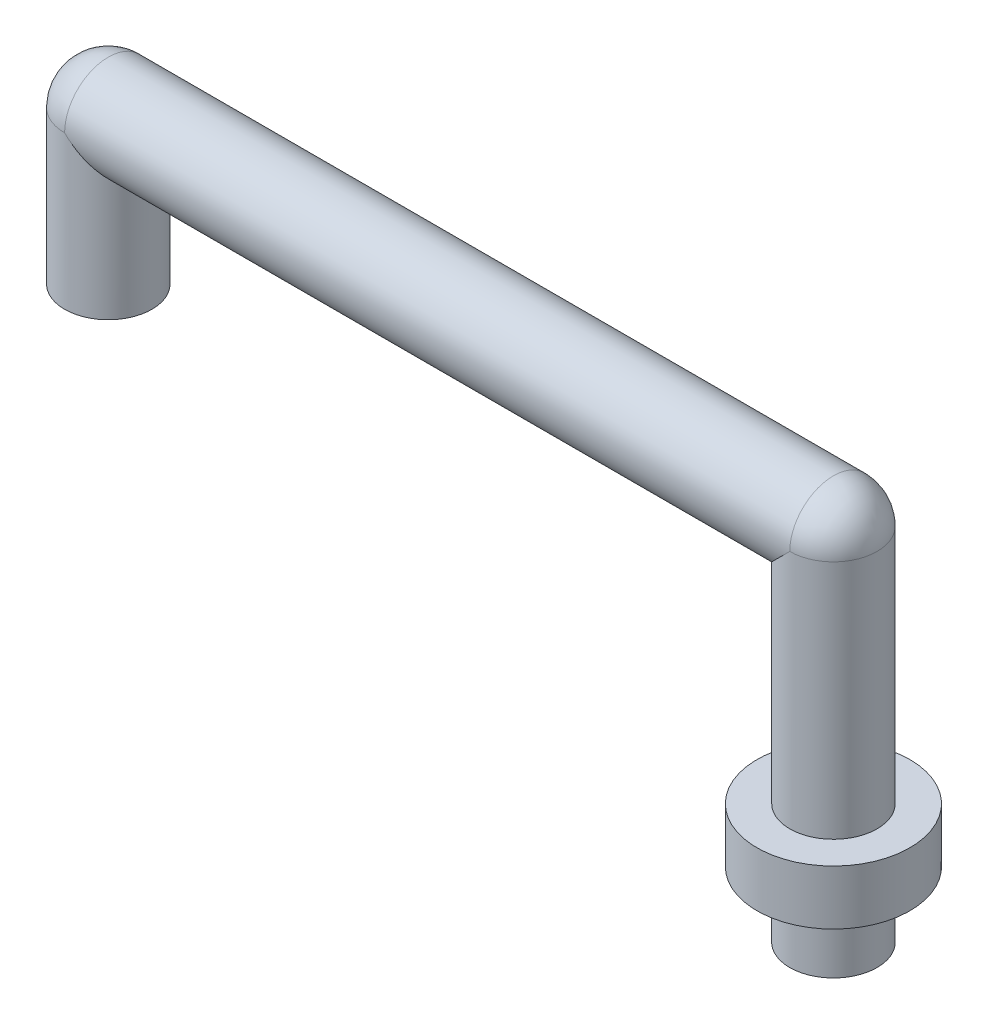
ISO-10303-21;
HEADER;
FILE_DESCRIPTION(('STEP AP214'),'2;1');
FILE_NAME('part.step','',(''),(''),'','','');
FILE_SCHEMA(('AUTOMOTIVE_DESIGN { 1 0 10303 214 1 1 1 1 }'));
ENDSEC;
DATA;
#1=APPLICATION_CONTEXT('core data for automotive mechanical design processes');
#2=APPLICATION_PROTOCOL_DEFINITION('international standard','automotive_design',2000,#1);
#3=PRODUCT_CONTEXT('',#1,'mechanical');
#4=PRODUCT('Part','Part','',(#3));
#5=PRODUCT_RELATED_PRODUCT_CATEGORY('part','',(#4));
#6=PRODUCT_DEFINITION_FORMATION('','',#4);
#7=PRODUCT_DEFINITION_CONTEXT('part definition',#1,'design');
#8=PRODUCT_DEFINITION('design','',#6,#7);
#9=PRODUCT_DEFINITION_SHAPE('','',#8);
#10=(LENGTH_UNIT() NAMED_UNIT(*) SI_UNIT(.MILLI.,.METRE.));
#11=(NAMED_UNIT(*) PLANE_ANGLE_UNIT() SI_UNIT($,.RADIAN.));
#12=(NAMED_UNIT(*) SI_UNIT($,.STERADIAN.) SOLID_ANGLE_UNIT());
#13=UNCERTAINTY_MEASURE_WITH_UNIT(LENGTH_MEASURE(1.E-05),#10,'distance_accuracy_value','');
#14=(GEOMETRIC_REPRESENTATION_CONTEXT(3) GLOBAL_UNCERTAINTY_ASSIGNED_CONTEXT((#13)) GLOBAL_UNIT_ASSIGNED_CONTEXT((#10,
#11,#12)) REPRESENTATION_CONTEXT('',''));
#15=CARTESIAN_POINT('',(0.,0.,0.));
#16=DIRECTION('',(0.,0.,1.));
#17=DIRECTION('',(1.,0.,0.));
#18=AXIS2_PLACEMENT_3D('',#15,#16,#17);
#19=CARTESIAN_POINT('',(0.,41.91,0.));
#20=DIRECTION('',(0.,-1.,0.));
#21=DIRECTION('',(0.,0.,-1.));
#22=AXIS2_PLACEMENT_3D('',#19,#20,#21);
#23=CYLINDRICAL_SURFACE('',#22,5.08);
#24=CARTESIAN_POINT('',(0.,13.97,0.));
#25=DIRECTION('',(0.,-1.,0.));
#26=DIRECTION('',(0.,0.,-1.));
#27=AXIS2_PLACEMENT_3D('',#24,#25,#26);
#28=CIRCLE('',#27,5.08);
#29=CARTESIAN_POINT('',(0.,13.97,-5.08));
#30=VERTEX_POINT('',#29);
#31=EDGE_CURVE('E11',#30,#30,#28,.T.);
#32=ORIENTED_EDGE('',*,*,#31,.F.);
#33=EDGE_LOOP('',(#32));
#34=FACE_BOUND('',#33,.T.);
#35=CARTESIAN_POINT('',(0.,41.91,0.));
#36=DIRECTION('',(0.707106781186547,-0.707106781186547,0.));
#37=DIRECTION('',(-0.707106781186547,-0.707106781186547,0.));
#38=AXIS2_PLACEMENT_3D('',#35,#36,#37);
#39=ELLIPSE('',#38,7.18420489685532,5.08);
#40=CARTESIAN_POINT('',(0.,41.91,-5.08));
#41=VERTEX_POINT('',#40);
#42=CARTESIAN_POINT('',(0.,41.91,5.08));
#43=VERTEX_POINT('',#42);
#44=EDGE_CURVE('E86',#41,#43,#39,.F.);
#45=ORIENTED_EDGE('',*,*,#44,.F.);
#46=CARTESIAN_POINT('',(0.,41.91,0.));
#47=DIRECTION('',(0.,1.,0.));
#48=DIRECTION('',(0.,0.,1.));
#49=AXIS2_PLACEMENT_3D('',#46,#47,#48);
#50=CIRCLE('',#49,5.08);
#51=EDGE_CURVE('E61',#43,#41,#50,.T.);
#52=ORIENTED_EDGE('',*,*,#51,.F.);
#53=EDGE_LOOP('',(#45,#52));
#54=FACE_BOUND('',#53,.T.);
#55=ADVANCED_FACE('F41',(#34,#54),#23,.T.);
#56=CARTESIAN_POINT('',(-8.89,13.97,0.));
#57=DIRECTION('',(0.,-1.,0.));
#58=DIRECTION('',(0.,0.,-1.));
#59=AXIS2_PLACEMENT_3D('',#56,#57,#58);
#60=PLANE('',#59);
#61=ORIENTED_EDGE('',*,*,#31,.T.);
#62=EDGE_LOOP('',(#61));
#63=FACE_BOUND('',#62,.T.);
#64=CARTESIAN_POINT('',(0.,13.97,0.));
#65=DIRECTION('',(0.,-1.,0.));
#66=DIRECTION('',(0.,0.,-1.));
#67=AXIS2_PLACEMENT_3D('',#64,#65,#66);
#68=CIRCLE('',#67,8.89);
#69=CARTESIAN_POINT('',(0.,13.97,-8.89));
#70=VERTEX_POINT('',#69);
#71=EDGE_CURVE('E91',#70,#70,#68,.T.);
#72=ORIENTED_EDGE('',*,*,#71,.F.);
#73=EDGE_LOOP('',(#72));
#74=FACE_BOUND('',#73,.T.);
#75=ADVANCED_FACE('F116',(#63,#74),#60,.F.);
#76=CARTESIAN_POINT('',(0.,0.,0.));
#77=DIRECTION('',(0.,-1.,0.));
#78=DIRECTION('',(0.,0.,-1.));
#79=AXIS2_PLACEMENT_3D('',#76,#77,#78);
#80=CYLINDRICAL_SURFACE('',#79,8.89);
#81=CARTESIAN_POINT('',(0.,7.62,0.));
#82=DIRECTION('',(0.,-1.,0.));
#83=DIRECTION('',(0.,0.,-1.));
#84=AXIS2_PLACEMENT_3D('',#81,#82,#83);
#85=CIRCLE('',#84,8.89);
#86=CARTESIAN_POINT('',(0.,7.62,-8.89));
#87=VERTEX_POINT('',#86);
#88=EDGE_CURVE('E88',#87,#87,#85,.T.);
#89=ORIENTED_EDGE('',*,*,#88,.F.);
#90=EDGE_LOOP('',(#89));
#91=FACE_BOUND('',#90,.T.);
#92=ORIENTED_EDGE('',*,*,#71,.T.);
#93=EDGE_LOOP('',(#92));
#94=FACE_BOUND('',#93,.T.);
#95=ADVANCED_FACE('F122',(#91,#94),#80,.T.);
#96=CARTESIAN_POINT('',(0.,7.62,0.));
#97=DIRECTION('',(0.,1.,0.));
#98=DIRECTION('',(0.,0.,1.));
#99=AXIS2_PLACEMENT_3D('',#96,#97,#98);
#100=PLANE('',#99);
#101=CARTESIAN_POINT('',(0.,7.61999999999999,0.));
#102=DIRECTION('',(0.,1.,0.));
#103=DIRECTION('',(0.,0.,1.));
#104=AXIS2_PLACEMENT_3D('',#101,#102,#103);
#105=CIRCLE('',#104,5.08);
#106=CARTESIAN_POINT('',(0.,7.61999999999999,5.08));
#107=VERTEX_POINT('',#106);
#108=EDGE_CURVE('E48',#107,#107,#105,.T.);
#109=ORIENTED_EDGE('',*,*,#108,.T.);
#110=EDGE_LOOP('',(#109));
#111=FACE_BOUND('',#110,.T.);
#112=ORIENTED_EDGE('',*,*,#88,.T.);
#113=EDGE_LOOP('',(#112));
#114=FACE_BOUND('',#113,.T.);
#115=ADVANCED_FACE('F100',(#111,#114),#100,.F.);
#116=CARTESIAN_POINT('',(0.,0.,0.));
#117=DIRECTION('',(0.,1.,0.));
#118=DIRECTION('',(0.,0.,1.));
#119=AXIS2_PLACEMENT_3D('',#116,#117,#118);
#120=PLANE('',#119);
#121=CARTESIAN_POINT('',(0.,0.,0.));
#122=DIRECTION('',(0.,1.,0.));
#123=DIRECTION('',(0.,0.,1.));
#124=AXIS2_PLACEMENT_3D('',#121,#122,#123);
#125=CIRCLE('',#124,5.08);
#126=CARTESIAN_POINT('',(0.,0.,5.08));
#127=VERTEX_POINT('',#126);
#128=EDGE_CURVE('E94',#127,#127,#125,.T.);
#129=ORIENTED_EDGE('',*,*,#128,.F.);
#130=EDGE_LOOP('',(#129));
#131=FACE_BOUND('',#130,.T.);
#132=ADVANCED_FACE('F105',(#131),#120,.F.);
#133=ORIENTED_EDGE('',*,*,#128,.T.);
#134=EDGE_LOOP('',(#133));
#135=FACE_BOUND('',#134,.T.);
#136=ORIENTED_EDGE('',*,*,#108,.F.);
#137=EDGE_LOOP('',(#136));
#138=FACE_BOUND('',#137,.T.);
#139=ADVANCED_FACE('F103',(#135,#138),#23,.T.);
#140=CARTESIAN_POINT('',(-84.328,41.91,0.));
#141=DIRECTION('',(-1.,0.,0.));
#142=DIRECTION('',(0.,0.,1.));
#143=AXIS2_PLACEMENT_3D('',#140,#141,#142);
#144=CYLINDRICAL_SURFACE('',#143,5.08);
#145=CARTESIAN_POINT('',(-84.328,41.91,0.));
#146=DIRECTION('',(-1.,0.,0.));
#147=DIRECTION('',(0.,0.,1.));
#148=AXIS2_PLACEMENT_3D('',#145,#146,#147);
#149=CIRCLE('',#148,5.07999999999999);
#150=CARTESIAN_POINT('',(-84.328,41.91,5.07999999999999));
#151=VERTEX_POINT('',#150);
#152=CARTESIAN_POINT('',(-84.328,41.91,-5.07999999999999));
#153=VERTEX_POINT('',#152);
#154=EDGE_CURVE('E54',#151,#153,#149,.T.);
#155=ORIENTED_EDGE('',*,*,#154,.F.);
#156=CARTESIAN_POINT('',(-84.328,41.91,0.));
#157=DIRECTION('',(-0.707106781186547,-0.707106781186547,0.));
#158=DIRECTION('',(-0.707106781186547,0.707106781186547,0.));
#159=AXIS2_PLACEMENT_3D('',#156,#157,#158);
#160=ELLIPSE('',#159,7.18420489685531,5.07999999999999);
#161=EDGE_CURVE('E66',#151,#153,#160,.F.);
#162=ORIENTED_EDGE('',*,*,#161,.T.);
#163=EDGE_LOOP('',(#155,#162));
#164=FACE_BOUND('',#163,.T.);
#165=CARTESIAN_POINT('',(0.,41.91,0.));
#166=DIRECTION('',(-1.,0.,0.));
#167=DIRECTION('',(0.,0.,1.));
#168=AXIS2_PLACEMENT_3D('',#165,#166,#167);
#169=CIRCLE('',#168,5.08);
#170=EDGE_CURVE('E76',#43,#41,#169,.T.);
#171=ORIENTED_EDGE('',*,*,#170,.T.);
#172=ORIENTED_EDGE('',*,*,#44,.T.);
#173=EDGE_LOOP('',(#171,#172));
#174=FACE_BOUND('',#173,.T.);
#175=ADVANCED_FACE('F67',(#164,#174),#144,.T.);
#176=CARTESIAN_POINT('',(0.,41.91,0.));
#177=DIRECTION('',(-1.,0.,0.));
#178=DIRECTION('',(0.,0.,-1.));
#179=AXIS2_PLACEMENT_3D('',#176,#177,#178);
#180=SPHERICAL_SURFACE('',#179,5.08);
#181=ORIENTED_EDGE('',*,*,#51,.T.);
#182=ORIENTED_EDGE('',*,*,#170,.F.);
#183=EDGE_LOOP('',(#181,#182));
#184=FACE_BOUND('',#183,.T.);
#185=ADVANCED_FACE('F112',(#184),#180,.T.);
#186=CARTESIAN_POINT('',(-84.328,41.91,0.));
#187=DIRECTION('',(0.,1.,0.));
#188=DIRECTION('',(0.,0.,1.));
#189=AXIS2_PLACEMENT_3D('',#186,#187,#188);
#190=SPHERICAL_SURFACE('',#189,5.07999999999999);
#191=ORIENTED_EDGE('',*,*,#154,.T.);
#192=CARTESIAN_POINT('',(-84.328,41.91,0.));
#193=DIRECTION('',(0.,1.,0.));
#194=DIRECTION('',(0.,0.,1.));
#195=AXIS2_PLACEMENT_3D('',#192,#193,#194);
#196=CIRCLE('',#195,5.07999999999999);
#197=EDGE_CURVE('E72',#153,#151,#196,.T.);
#198=ORIENTED_EDGE('',*,*,#197,.T.);
#199=EDGE_LOOP('',(#191,#198));
#200=FACE_BOUND('',#199,.T.);
#201=ADVANCED_FACE('F75',(#200),#190,.T.);
#202=CARTESIAN_POINT('',(-84.328,46.99,0.));
#203=DIRECTION('',(0.,1.,0.));
#204=DIRECTION('',(0.,0.,1.));
#205=AXIS2_PLACEMENT_3D('',#202,#203,#204);
#206=CYLINDRICAL_SURFACE('',#205,5.07999999999999);
#207=CARTESIAN_POINT('',(-84.328,24.13,0.));
#208=DIRECTION('',(0.,1.,0.));
#209=DIRECTION('',(0.,0.,1.));
#210=AXIS2_PLACEMENT_3D('',#207,#208,#209);
#211=CIRCLE('',#210,5.07999999999999);
#212=CARTESIAN_POINT('',(-84.328,24.13,5.07999999999999));
#213=VERTEX_POINT('',#212);
#214=EDGE_CURVE('E79',#213,#213,#211,.T.);
#215=ORIENTED_EDGE('',*,*,#214,.T.);
#216=EDGE_LOOP('',(#215));
#217=FACE_BOUND('',#216,.T.);
#218=ORIENTED_EDGE('',*,*,#161,.F.);
#219=ORIENTED_EDGE('',*,*,#197,.F.);
#220=EDGE_LOOP('',(#218,#219));
#221=FACE_BOUND('',#220,.T.);
#222=ADVANCED_FACE('F78',(#217,#221),#206,.T.);
#223=CARTESIAN_POINT('',(-84.328,24.13,-5.07999999999999));
#224=DIRECTION('',(0.,-1.,0.));
#225=DIRECTION('',(0.,0.,-1.));
#226=AXIS2_PLACEMENT_3D('',#223,#224,#225);
#227=PLANE('',#226);
#228=ORIENTED_EDGE('',*,*,#214,.F.);
#229=EDGE_LOOP('',(#228));
#230=FACE_BOUND('',#229,.T.);
#231=ADVANCED_FACE('F168',(#230),#227,.T.);
#232=CLOSED_SHELL('',(#55,#75,#95,#115,#132,#139,#175,#185,#201,#222,#231));
#233=MANIFOLD_SOLID_BREP('B2',#232);
#234=ADVANCED_BREP_SHAPE_REPRESENTATION('',(#18,#233),#14);
#235=SHAPE_DEFINITION_REPRESENTATION(#9,#234);
ENDSEC;
END-ISO-10303-21;
